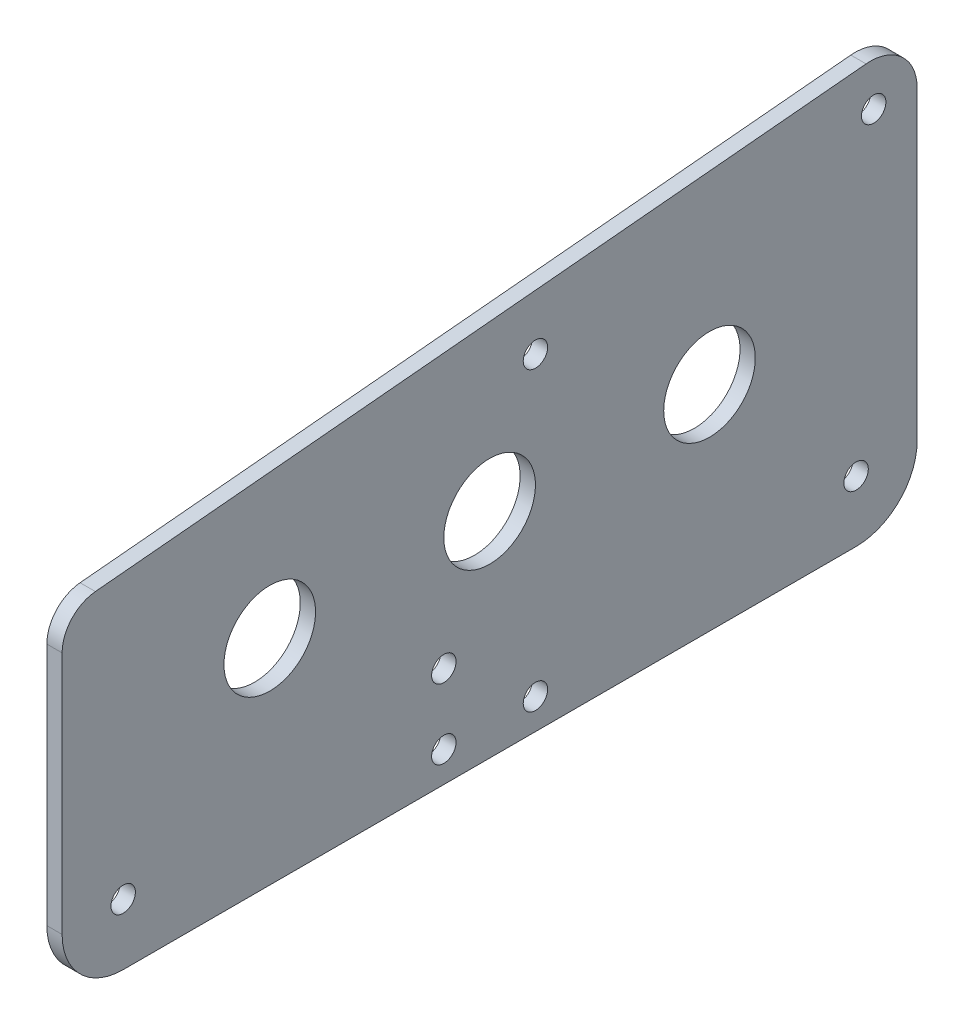
ISO-10303-21;
HEADER;
FILE_DESCRIPTION(('STEP AP214'),'2;1');
FILE_NAME('part.step','',(''),(''),'','','');
FILE_SCHEMA(('AUTOMOTIVE_DESIGN { 1 0 10303 214 1 1 1 1 }'));
ENDSEC;
DATA;
#1=APPLICATION_CONTEXT('core data for automotive mechanical design processes');
#2=APPLICATION_PROTOCOL_DEFINITION('international standard','automotive_design',2000,#1);
#3=PRODUCT_CONTEXT('',#1,'mechanical');
#4=PRODUCT('Part','Part','',(#3));
#5=PRODUCT_RELATED_PRODUCT_CATEGORY('part','',(#4));
#6=PRODUCT_DEFINITION_FORMATION('','',#4);
#7=PRODUCT_DEFINITION_CONTEXT('part definition',#1,'design');
#8=PRODUCT_DEFINITION('design','',#6,#7);
#9=PRODUCT_DEFINITION_SHAPE('','',#8);
#10=(LENGTH_UNIT() NAMED_UNIT(*) SI_UNIT(.MILLI.,.METRE.));
#11=(NAMED_UNIT(*) PLANE_ANGLE_UNIT() SI_UNIT($,.RADIAN.));
#12=(NAMED_UNIT(*) SI_UNIT($,.STERADIAN.) SOLID_ANGLE_UNIT());
#13=UNCERTAINTY_MEASURE_WITH_UNIT(LENGTH_MEASURE(1.E-05),#10,'distance_accuracy_value','');
#14=(GEOMETRIC_REPRESENTATION_CONTEXT(3) GLOBAL_UNCERTAINTY_ASSIGNED_CONTEXT((#13)) GLOBAL_UNIT_ASSIGNED_CONTEXT((#10,
#11,#12)) REPRESENTATION_CONTEXT('',''));
#15=CARTESIAN_POINT('',(0.,0.,0.));
#16=DIRECTION('',(0.,0.,1.));
#17=DIRECTION('',(1.,0.,0.));
#18=AXIS2_PLACEMENT_3D('',#15,#16,#17);
#19=CARTESIAN_POINT('',(4.7625,43.2742885665232,519.572478048036));
#20=DIRECTION('',(1.,0.,0.));
#21=DIRECTION('',(0.,0.,1.));
#22=AXIS2_PLACEMENT_3D('',#19,#20,#21);
#23=CYLINDRICAL_SURFACE('',#22,12.7);
#24=DIRECTION('',(1.,0.,0.));
#25=VECTOR('',#24,1.);
#26=CARTESIAN_POINT('',(4.7625,43.2742885665232,506.872478048036));
#27=LINE('',#26,#25);
#28=CARTESIAN_POINT('',(1.5875,43.2742885665232,506.872478048036));
#29=VERTEX_POINT('',#28);
#30=CARTESIAN_POINT('',(4.7625,43.2742885665232,506.872478048036));
#31=VERTEX_POINT('',#30);
#32=EDGE_CURVE('E11',#29,#31,#27,.T.);
#33=ORIENTED_EDGE('',*,*,#32,.T.);
#34=CARTESIAN_POINT('',(4.7625,43.2742885665232,519.572478048036));
#35=DIRECTION('',(-1.,0.,0.));
#36=DIRECTION('',(0.,0.,1.));
#37=AXIS2_PLACEMENT_3D('',#34,#35,#36);
#38=CIRCLE('',#37,12.7);
#39=CARTESIAN_POINT('',(4.7625,30.5742885665231,519.572478048036));
#40=VERTEX_POINT('',#39);
#41=EDGE_CURVE('E191',#31,#40,#38,.T.);
#42=ORIENTED_EDGE('',*,*,#41,.T.);
#43=DIRECTION('',(1.,0.,0.));
#44=VECTOR('',#43,1.);
#45=CARTESIAN_POINT('',(4.7625,30.5742885665231,519.572478048036));
#46=LINE('',#45,#44);
#47=CARTESIAN_POINT('',(1.5875,30.5742885665231,519.572478048036));
#48=VERTEX_POINT('',#47);
#49=EDGE_CURVE('E49',#48,#40,#46,.T.);
#50=ORIENTED_EDGE('',*,*,#49,.F.);
#51=CARTESIAN_POINT('',(1.5875,43.2742885665232,519.572478048036));
#52=DIRECTION('',(-1.,0.,0.));
#53=DIRECTION('',(0.,0.,1.));
#54=AXIS2_PLACEMENT_3D('',#51,#52,#53);
#55=CIRCLE('',#54,12.7);
#56=EDGE_CURVE('E95',#29,#48,#55,.T.);
#57=ORIENTED_EDGE('',*,*,#56,.F.);
#58=EDGE_LOOP('',(#33,#42,#50,#57));
#59=FACE_BOUND('',#58,.T.);
#60=ADVANCED_FACE('F39',(#59),#23,.T.);
#61=CARTESIAN_POINT('',(4.7625,30.5742885665232,671.972478048036));
#62=DIRECTION('',(0.,-1.,0.));
#63=DIRECTION('',(0.,0.,1.));
#64=AXIS2_PLACEMENT_3D('',#61,#62,#63);
#65=PLANE('',#64);
#66=ORIENTED_EDGE('',*,*,#49,.T.);
#67=DIRECTION('',(0.,0.,1.));
#68=VECTOR('',#67,1.);
#69=CARTESIAN_POINT('',(4.7625,30.5742885665232,671.972478048036));
#70=LINE('',#69,#68);
#71=CARTESIAN_POINT('',(4.7625,30.5742885665231,671.972478048036));
#72=VERTEX_POINT('',#71);
#73=EDGE_CURVE('E186',#40,#72,#70,.T.);
#74=ORIENTED_EDGE('',*,*,#73,.T.);
#75=DIRECTION('',(1.,0.,0.));
#76=VECTOR('',#75,1.);
#77=CARTESIAN_POINT('',(4.7625,30.5742885665231,671.972478048036));
#78=LINE('',#77,#76);
#79=CARTESIAN_POINT('',(1.5875,30.5742885665231,671.972478048036));
#80=VERTEX_POINT('',#79);
#81=EDGE_CURVE('E173',#80,#72,#78,.T.);
#82=ORIENTED_EDGE('',*,*,#81,.F.);
#83=DIRECTION('',(0.,0.,1.));
#84=VECTOR('',#83,1.);
#85=CARTESIAN_POINT('',(1.5875,30.5742885665231,516.597442574255));
#86=LINE('',#85,#84);
#87=EDGE_CURVE('E146',#48,#80,#86,.T.);
#88=ORIENTED_EDGE('',*,*,#87,.F.);
#89=EDGE_LOOP('',(#66,#74,#82,#88));
#90=FACE_BOUND('',#89,.T.);
#91=ADVANCED_FACE('F182',(#90),#65,.T.);
#92=CARTESIAN_POINT('',(4.7625,43.2742885665232,671.972478048036));
#93=DIRECTION('',(1.,0.,0.));
#94=DIRECTION('',(0.,0.,1.));
#95=AXIS2_PLACEMENT_3D('',#92,#93,#94);
#96=CYLINDRICAL_SURFACE('',#95,12.7);
#97=ORIENTED_EDGE('',*,*,#81,.T.);
#98=CARTESIAN_POINT('',(4.7625,43.2742885665232,671.972478048036));
#99=DIRECTION('',(-1.,0.,0.));
#100=DIRECTION('',(0.,0.,1.));
#101=AXIS2_PLACEMENT_3D('',#98,#99,#100);
#102=CIRCLE('',#101,12.7);
#103=CARTESIAN_POINT('',(4.7625,43.2742885665232,684.672478048036));
#104=VERTEX_POINT('',#103);
#105=EDGE_CURVE('E194',#72,#104,#102,.T.);
#106=ORIENTED_EDGE('',*,*,#105,.T.);
#107=DIRECTION('',(1.,0.,0.));
#108=VECTOR('',#107,1.);
#109=CARTESIAN_POINT('',(4.7625,43.2742885665232,684.672478048036));
#110=LINE('',#109,#108);
#111=CARTESIAN_POINT('',(1.5875,43.2742885665232,684.672478048036));
#112=VERTEX_POINT('',#111);
#113=EDGE_CURVE('E170',#112,#104,#110,.T.);
#114=ORIENTED_EDGE('',*,*,#113,.F.);
#115=CARTESIAN_POINT('',(1.5875,43.2742885665232,671.972478048036));
#116=DIRECTION('',(-1.,0.,0.));
#117=DIRECTION('',(0.,0.,1.));
#118=AXIS2_PLACEMENT_3D('',#115,#116,#117);
#119=CIRCLE('',#118,12.7);
#120=EDGE_CURVE('E143',#80,#112,#119,.T.);
#121=ORIENTED_EDGE('',*,*,#120,.F.);
#122=EDGE_LOOP('',(#97,#106,#114,#121));
#123=FACE_BOUND('',#122,.T.);
#124=ADVANCED_FACE('F251',(#123),#96,.T.);
#125=CARTESIAN_POINT('',(4.7625,93.978860816529,684.672478048036));
#126=DIRECTION('',(0.,0.,1.));
#127=DIRECTION('',(0.,1.,0.));
#128=AXIS2_PLACEMENT_3D('',#125,#126,#127);
#129=PLANE('',#128);
#130=ORIENTED_EDGE('',*,*,#113,.T.);
#131=DIRECTION('',(0.,1.,0.));
#132=VECTOR('',#131,1.);
#133=CARTESIAN_POINT('',(4.7625,93.978860816529,684.672478048036));
#134=LINE('',#133,#132);
#135=CARTESIAN_POINT('',(4.7625,93.978860816529,684.672478048036));
#136=VERTEX_POINT('',#135);
#137=EDGE_CURVE('E201',#104,#136,#134,.T.);
#138=ORIENTED_EDGE('',*,*,#137,.T.);
#139=DIRECTION('',(1.,0.,0.));
#140=VECTOR('',#139,1.);
#141=CARTESIAN_POINT('',(4.7625,93.978860816529,684.672478048036));
#142=LINE('',#141,#140);
#143=CARTESIAN_POINT('',(1.5875,93.978860816529,684.672478048036));
#144=VERTEX_POINT('',#143);
#145=EDGE_CURVE('E167',#144,#136,#142,.T.);
#146=ORIENTED_EDGE('',*,*,#145,.F.);
#147=DIRECTION('',(0.,1.,0.));
#148=VECTOR('',#147,1.);
#149=CARTESIAN_POINT('',(1.5875,106.774288566523,684.672478048036));
#150=LINE('',#149,#148);
#151=EDGE_CURVE('E140',#112,#144,#150,.T.);
#152=ORIENTED_EDGE('',*,*,#151,.F.);
#153=EDGE_LOOP('',(#130,#138,#146,#152));
#154=FACE_BOUND('',#153,.T.);
#155=ADVANCED_FACE('F337',(#154),#129,.T.);
#156=CARTESIAN_POINT('',(4.7625,93.978860816529,677.052478048036));
#157=DIRECTION('',(1.,0.,0.));
#158=DIRECTION('',(0.,0.,1.));
#159=AXIS2_PLACEMENT_3D('',#156,#157,#158);
#160=CYLINDRICAL_SURFACE('',#159,7.61999999999997);
#161=ORIENTED_EDGE('',*,*,#145,.T.);
#162=CARTESIAN_POINT('',(4.7625,93.978860816529,677.052478048036));
#163=DIRECTION('',(-1.,0.,0.));
#164=DIRECTION('',(0.,0.,1.));
#165=AXIS2_PLACEMENT_3D('',#162,#163,#164);
#166=CIRCLE('',#165,7.61999999999997);
#167=CARTESIAN_POINT('',(4.7625,101.566176390487,677.757490375002));
#168=VERTEX_POINT('',#167);
#169=EDGE_CURVE('E204',#136,#168,#166,.T.);
#170=ORIENTED_EDGE('',*,*,#169,.T.);
#171=DIRECTION('',(1.,0.,0.));
#172=VECTOR('',#171,1.);
#173=CARTESIAN_POINT('',(4.7625,101.566176390487,677.757490375002));
#174=LINE('',#173,#172);
#175=CARTESIAN_POINT('',(1.5875,101.566176390487,677.757490375002));
#176=VERTEX_POINT('',#175);
#177=EDGE_CURVE('E110',#176,#168,#174,.T.);
#178=ORIENTED_EDGE('',*,*,#177,.F.);
#179=CARTESIAN_POINT('',(1.5875,93.978860816529,677.052478048036));
#180=DIRECTION('',(-1.,0.,0.));
#181=DIRECTION('',(0.,0.,1.));
#182=AXIS2_PLACEMENT_3D('',#179,#180,#181);
#183=CIRCLE('',#182,7.61999999999997);
#184=EDGE_CURVE('E138',#144,#176,#183,.T.);
#185=ORIENTED_EDGE('',*,*,#184,.F.);
#186=EDGE_LOOP('',(#161,#170,#178,#185));
#187=FACE_BOUND('',#186,.T.);
#188=ADVANCED_FACE('F347',(#187),#160,.T.);
#189=CARTESIAN_POINT('',(4.7625,116.457539853395,517.497208961432));
#190=DIRECTION('',(0.,0.995710705243837,0.0925213027514316));
#191=DIRECTION('',(0.,0.0925213027514316,-0.995710705243836));
#192=AXIS2_PLACEMENT_3D('',#189,#190,#191);
#193=PLANE('',#192);
#194=ORIENTED_EDGE('',*,*,#177,.T.);
#195=DIRECTION('',(0.,0.0925213027514316,-0.995710705243836));
#196=VECTOR('',#195,1.);
#197=CARTESIAN_POINT('',(4.7625,116.457539853395,517.497208961432));
#198=LINE('',#197,#196);
#199=CARTESIAN_POINT('',(4.7625,116.457539853395,517.497208961432));
#200=VERTEX_POINT('',#199);
#201=EDGE_CURVE('E207',#168,#200,#198,.T.);
#202=ORIENTED_EDGE('',*,*,#201,.T.);
#203=DIRECTION('',(1.,0.,0.));
#204=VECTOR('',#203,1.);
#205=CARTESIAN_POINT('',(4.7625,116.457539853395,517.497208961432));
#206=LINE('',#205,#204);
#207=CARTESIAN_POINT('',(1.5875,116.457539853395,517.497208961432));
#208=VERTEX_POINT('',#207);
#209=EDGE_CURVE('E108',#208,#200,#206,.T.);
#210=ORIENTED_EDGE('',*,*,#209,.F.);
#211=DIRECTION('',(0.,0.0925213027514316,-0.995710705243836));
#212=VECTOR('',#211,1.);
#213=CARTESIAN_POINT('',(1.5875,116.457539853395,517.497208961432));
#214=LINE('',#213,#212);
#215=EDGE_CURVE('E102',#176,#208,#214,.T.);
#216=ORIENTED_EDGE('',*,*,#215,.F.);
#217=EDGE_LOOP('',(#194,#202,#210,#216));
#218=FACE_BOUND('',#217,.T.);
#219=ADVANCED_FACE('F357',(#218),#193,.T.);
#220=CARTESIAN_POINT('',(4.7625,106.774288566523,516.597442574255));
#221=DIRECTION('',(1.,0.,0.));
#222=DIRECTION('',(0.,0.,1.));
#223=AXIS2_PLACEMENT_3D('',#220,#221,#222);
#224=CYLINDRICAL_SURFACE('',#223,9.72496452621818);
#225=ORIENTED_EDGE('',*,*,#209,.T.);
#226=CARTESIAN_POINT('',(4.7625,106.774288566523,516.597442574255));
#227=DIRECTION('',(-1.,0.,0.));
#228=DIRECTION('',(0.,0.,1.));
#229=AXIS2_PLACEMENT_3D('',#226,#227,#228);
#230=CIRCLE('',#229,9.72496452621818);
#231=CARTESIAN_POINT('',(4.7625,106.774288566523,506.872478048036));
#232=VERTEX_POINT('',#231);
#233=EDGE_CURVE('E57',#200,#232,#230,.T.);
#234=ORIENTED_EDGE('',*,*,#233,.T.);
#235=DIRECTION('',(1.,0.,0.));
#236=VECTOR('',#235,1.);
#237=CARTESIAN_POINT('',(4.7625,106.774288566523,506.872478048036));
#238=LINE('',#237,#236);
#239=CARTESIAN_POINT('',(1.5875,106.774288566523,506.872478048036));
#240=VERTEX_POINT('',#239);
#241=EDGE_CURVE('E43',#240,#232,#238,.T.);
#242=ORIENTED_EDGE('',*,*,#241,.F.);
#243=CARTESIAN_POINT('',(1.5875,106.774288566523,516.597442574255));
#244=DIRECTION('',(-1.,0.,0.));
#245=DIRECTION('',(0.,0.,1.));
#246=AXIS2_PLACEMENT_3D('',#243,#244,#245);
#247=CIRCLE('',#246,9.72496452621818);
#248=EDGE_CURVE('E96',#208,#240,#247,.T.);
#249=ORIENTED_EDGE('',*,*,#248,.F.);
#250=EDGE_LOOP('',(#225,#234,#242,#249));
#251=FACE_BOUND('',#250,.T.);
#252=ADVANCED_FACE('F107',(#251),#224,.T.);
#253=CARTESIAN_POINT('',(4.7625,43.2742885665232,519.572478048036));
#254=DIRECTION('',(1.,0.,0.));
#255=DIRECTION('',(0.,0.,1.));
#256=AXIS2_PLACEMENT_3D('',#253,#254,#255);
#257=CYLINDRICAL_SURFACE('',#256,2.53999999999995);
#258=CARTESIAN_POINT('',(4.7625,43.2742885665232,519.572478048036));
#259=DIRECTION('',(-1.,0.,0.));
#260=DIRECTION('',(0.,0.,1.));
#261=AXIS2_PLACEMENT_3D('',#258,#259,#260);
#262=CIRCLE('',#261,2.53999999999995);
#263=CARTESIAN_POINT('',(4.7625,43.2742885665232,522.112478048036));
#264=VERTEX_POINT('',#263);
#265=EDGE_CURVE('E163',#264,#264,#262,.T.);
#266=ORIENTED_EDGE('',*,*,#265,.F.);
#267=EDGE_LOOP('',(#266));
#268=FACE_BOUND('',#267,.T.);
#269=CARTESIAN_POINT('',(1.5875,43.2742885665232,519.572478048036));
#270=DIRECTION('',(-1.,0.,0.));
#271=DIRECTION('',(0.,0.,1.));
#272=AXIS2_PLACEMENT_3D('',#269,#270,#271);
#273=CIRCLE('',#272,2.53999999999995);
#274=CARTESIAN_POINT('',(1.5875,43.2742885665232,522.112478048036));
#275=VERTEX_POINT('',#274);
#276=EDGE_CURVE('E122',#275,#275,#273,.T.);
#277=ORIENTED_EDGE('',*,*,#276,.T.);
#278=EDGE_LOOP('',(#277));
#279=FACE_BOUND('',#278,.T.);
#280=ADVANCED_FACE('F311',(#268,#279),#257,.F.);
#281=CARTESIAN_POINT('',(4.7625,36.9242885665232,605.297478048036));
#282=DIRECTION('',(1.,0.,0.));
#283=DIRECTION('',(0.,0.,1.));
#284=AXIS2_PLACEMENT_3D('',#281,#282,#283);
#285=CYLINDRICAL_SURFACE('',#284,2.53999999999995);
#286=CARTESIAN_POINT('',(4.7625,36.9242885665232,605.297478048036));
#287=DIRECTION('',(-1.,0.,0.));
#288=DIRECTION('',(0.,0.,1.));
#289=AXIS2_PLACEMENT_3D('',#286,#287,#288);
#290=CIRCLE('',#289,2.53999999999995);
#291=CARTESIAN_POINT('',(4.7625,36.9242885665232,607.837478048036));
#292=VERTEX_POINT('',#291);
#293=EDGE_CURVE('E525',#292,#292,#290,.T.);
#294=ORIENTED_EDGE('',*,*,#293,.F.);
#295=EDGE_LOOP('',(#294));
#296=FACE_BOUND('',#295,.T.);
#297=CARTESIAN_POINT('',(1.5875,36.9242885665232,605.297478048036));
#298=DIRECTION('',(-1.,0.,0.));
#299=DIRECTION('',(0.,0.,1.));
#300=AXIS2_PLACEMENT_3D('',#297,#298,#299);
#301=CIRCLE('',#300,2.53999999999995);
#302=CARTESIAN_POINT('',(1.5875,36.9242885665232,607.837478048036));
#303=VERTEX_POINT('',#302);
#304=EDGE_CURVE('E125',#303,#303,#301,.T.);
#305=ORIENTED_EDGE('',*,*,#304,.T.);
#306=EDGE_LOOP('',(#305));
#307=FACE_BOUND('',#306,.T.);
#308=ADVANCED_FACE('F316',(#296,#307),#285,.F.);
#309=CARTESIAN_POINT('',(4.7625,98.5707187630519,586.247478048036));
#310=DIRECTION('',(1.,0.,0.));
#311=DIRECTION('',(0.,0.,1.));
#312=AXIS2_PLACEMENT_3D('',#309,#310,#311);
#313=CYLINDRICAL_SURFACE('',#312,2.53999999999995);
#314=CARTESIAN_POINT('',(4.7625,98.5707187630519,586.247478048036));
#315=DIRECTION('',(-1.,0.,0.));
#316=DIRECTION('',(0.,0.,1.));
#317=AXIS2_PLACEMENT_3D('',#314,#315,#316);
#318=CIRCLE('',#317,2.53999999999995);
#319=CARTESIAN_POINT('',(4.7625,98.5707187630519,588.787478048036));
#320=VERTEX_POINT('',#319);
#321=EDGE_CURVE('E520',#320,#320,#318,.T.);
#322=ORIENTED_EDGE('',*,*,#321,.F.);
#323=EDGE_LOOP('',(#322));
#324=FACE_BOUND('',#323,.T.);
#325=CARTESIAN_POINT('',(1.5875,98.5707187630519,586.247478048036));
#326=DIRECTION('',(-1.,0.,0.));
#327=DIRECTION('',(0.,0.,1.));
#328=AXIS2_PLACEMENT_3D('',#325,#326,#327);
#329=CIRCLE('',#328,2.53999999999995);
#330=CARTESIAN_POINT('',(1.5875,98.5707187630519,588.787478048036));
#331=VERTEX_POINT('',#330);
#332=EDGE_CURVE('E128',#331,#331,#329,.T.);
#333=ORIENTED_EDGE('',*,*,#332,.T.);
#334=EDGE_LOOP('',(#333));
#335=FACE_BOUND('',#334,.T.);
#336=ADVANCED_FACE('F327',(#324,#335),#313,.F.);
#337=CARTESIAN_POINT('',(4.7625,75.0242885665232,595.772478048036));
#338=DIRECTION('',(1.,0.,0.));
#339=DIRECTION('',(0.,0.,1.));
#340=AXIS2_PLACEMENT_3D('',#337,#338,#339);
#341=CYLINDRICAL_SURFACE('',#340,9.52500000000002);
#342=CARTESIAN_POINT('',(4.7625,75.0242885665232,595.772478048036));
#343=DIRECTION('',(-1.,0.,0.));
#344=DIRECTION('',(0.,0.,1.));
#345=AXIS2_PLACEMENT_3D('',#342,#343,#344);
#346=CIRCLE('',#345,9.52500000000002);
#347=CARTESIAN_POINT('',(4.7625,75.0242885665232,605.297478048036));
#348=VERTEX_POINT('',#347);
#349=EDGE_CURVE('E517',#348,#348,#346,.T.);
#350=ORIENTED_EDGE('',*,*,#349,.F.);
#351=EDGE_LOOP('',(#350));
#352=FACE_BOUND('',#351,.T.);
#353=CARTESIAN_POINT('',(1.5875,75.0242885665232,595.772478048036));
#354=DIRECTION('',(-1.,0.,0.));
#355=DIRECTION('',(0.,0.,1.));
#356=AXIS2_PLACEMENT_3D('',#353,#354,#355);
#357=CIRCLE('',#356,9.52500000000002);
#358=CARTESIAN_POINT('',(1.5875,75.0242885665232,605.297478048036));
#359=VERTEX_POINT('',#358);
#360=EDGE_CURVE('E131',#359,#359,#357,.T.);
#361=ORIENTED_EDGE('',*,*,#360,.T.);
#362=EDGE_LOOP('',(#361));
#363=FACE_BOUND('',#362,.T.);
#364=ADVANCED_FACE('F407',(#352,#363),#341,.F.);
#365=CARTESIAN_POINT('',(4.7625,107.527203864905,515.91124467509));
#366=DIRECTION('',(1.,0.,0.));
#367=DIRECTION('',(0.,0.,1.));
#368=AXIS2_PLACEMENT_3D('',#365,#366,#367);
#369=CYLINDRICAL_SURFACE('',#368,2.53999999999995);
#370=CARTESIAN_POINT('',(4.7625,107.527203864905,515.91124467509));
#371=DIRECTION('',(-1.,0.,0.));
#372=DIRECTION('',(0.,0.,1.));
#373=AXIS2_PLACEMENT_3D('',#370,#371,#372);
#374=CIRCLE('',#373,2.53999999999995);
#375=CARTESIAN_POINT('',(4.7625,107.527203864905,518.45124467509));
#376=VERTEX_POINT('',#375);
#377=EDGE_CURVE('E513',#376,#376,#374,.T.);
#378=ORIENTED_EDGE('',*,*,#377,.F.);
#379=EDGE_LOOP('',(#378));
#380=FACE_BOUND('',#379,.T.);
#381=CARTESIAN_POINT('',(1.5875,107.527203864905,515.91124467509));
#382=DIRECTION('',(-1.,0.,0.));
#383=DIRECTION('',(0.,0.,1.));
#384=AXIS2_PLACEMENT_3D('',#381,#382,#383);
#385=CIRCLE('',#384,2.53999999999995);
#386=CARTESIAN_POINT('',(1.5875,107.527203864905,518.45124467509));
#387=VERTEX_POINT('',#386);
#388=EDGE_CURVE('E105',#387,#387,#385,.T.);
#389=ORIENTED_EDGE('',*,*,#388,.T.);
#390=EDGE_LOOP('',(#389));
#391=FACE_BOUND('',#390,.T.);
#392=ADVANCED_FACE('F258',(#380,#391),#369,.F.);
#393=CARTESIAN_POINT('',(4.7625,43.2742885665232,506.872478048036));
#394=DIRECTION('',(0.,0.,-1.));
#395=DIRECTION('',(0.,-1.,0.));
#396=AXIS2_PLACEMENT_3D('',#393,#394,#395);
#397=PLANE('',#396);
#398=DIRECTION('',(0.,1.,0.));
#399=VECTOR('',#398,1.);
#400=CARTESIAN_POINT('',(1.5875,106.774288566523,506.872478048036));
#401=LINE('',#400,#399);
#402=EDGE_CURVE('E87',#240,#29,#401,.F.);
#403=ORIENTED_EDGE('',*,*,#402,.F.);
#404=ORIENTED_EDGE('',*,*,#241,.T.);
#405=DIRECTION('',(0.,-1.,0.));
#406=VECTOR('',#405,1.);
#407=CARTESIAN_POINT('',(4.7625,43.2742885665232,506.872478048036));
#408=LINE('',#407,#406);
#409=EDGE_CURVE('E192',#232,#31,#408,.T.);
#410=ORIENTED_EDGE('',*,*,#409,.T.);
#411=ORIENTED_EDGE('',*,*,#32,.F.);
#412=EDGE_LOOP('',(#403,#404,#410,#411));
#413=FACE_BOUND('',#412,.T.);
#414=ADVANCED_FACE('F92',(#413),#397,.T.);
#415=CARTESIAN_POINT('',(4.7625,75.0242885665232,550.052478048036));
#416=DIRECTION('',(1.,0.,0.));
#417=DIRECTION('',(0.,0.,1.));
#418=AXIS2_PLACEMENT_3D('',#415,#416,#417);
#419=CYLINDRICAL_SURFACE('',#418,9.52500000000002);
#420=CARTESIAN_POINT('',(4.7625,75.0242885665232,550.052478048036));
#421=DIRECTION('',(-1.,0.,0.));
#422=DIRECTION('',(0.,0.,1.));
#423=AXIS2_PLACEMENT_3D('',#420,#421,#422);
#424=CIRCLE('',#423,9.52500000000002);
#425=CARTESIAN_POINT('',(4.7625,75.0242885665232,559.577478048036));
#426=VERTEX_POINT('',#425);
#427=EDGE_CURVE('E210',#426,#426,#424,.T.);
#428=ORIENTED_EDGE('',*,*,#427,.F.);
#429=EDGE_LOOP('',(#428));
#430=FACE_BOUND('',#429,.T.);
#431=CARTESIAN_POINT('',(1.5875,75.0242885665232,550.052478048036));
#432=DIRECTION('',(-1.,0.,0.));
#433=DIRECTION('',(0.,0.,1.));
#434=AXIS2_PLACEMENT_3D('',#431,#432,#433);
#435=CIRCLE('',#434,9.52500000000002);
#436=CARTESIAN_POINT('',(1.5875,75.0242885665232,559.577478048036));
#437=VERTEX_POINT('',#436);
#438=EDGE_CURVE('E137',#437,#437,#435,.T.);
#439=ORIENTED_EDGE('',*,*,#438,.T.);
#440=EDGE_LOOP('',(#439));
#441=FACE_BOUND('',#440,.T.);
#442=ADVANCED_FACE('F257',(#430,#441),#419,.F.);
#443=CARTESIAN_POINT('',(4.7625,51.4778583699945,605.297478048036));
#444=DIRECTION('',(1.,0.,0.));
#445=DIRECTION('',(0.,0.,1.));
#446=AXIS2_PLACEMENT_3D('',#443,#444,#445);
#447=CYLINDRICAL_SURFACE('',#446,2.54000000000007);
#448=CARTESIAN_POINT('',(4.7625,51.4778583699945,605.297478048036));
#449=DIRECTION('',(-1.,0.,0.));
#450=DIRECTION('',(0.,0.,1.));
#451=AXIS2_PLACEMENT_3D('',#448,#449,#450);
#452=CIRCLE('',#451,2.54000000000007);
#453=CARTESIAN_POINT('',(4.7625,51.4778583699945,607.837478048036));
#454=VERTEX_POINT('',#453);
#455=EDGE_CURVE('E213',#454,#454,#452,.T.);
#456=ORIENTED_EDGE('',*,*,#455,.F.);
#457=EDGE_LOOP('',(#456));
#458=FACE_BOUND('',#457,.T.);
#459=CARTESIAN_POINT('',(1.5875,51.4778583699945,605.297478048036));
#460=DIRECTION('',(-1.,0.,0.));
#461=DIRECTION('',(0.,0.,1.));
#462=AXIS2_PLACEMENT_3D('',#459,#460,#461);
#463=CIRCLE('',#462,2.54000000000007);
#464=CARTESIAN_POINT('',(1.5875,51.4778583699945,607.837478048036));
#465=VERTEX_POINT('',#464);
#466=EDGE_CURVE('E152',#465,#465,#463,.T.);
#467=ORIENTED_EDGE('',*,*,#466,.T.);
#468=EDGE_LOOP('',(#467));
#469=FACE_BOUND('',#468,.T.);
#470=ADVANCED_FACE('F225',(#458,#469),#447,.F.);
#471=CARTESIAN_POINT('',(4.7625,75.0242885665232,641.492478048036));
#472=DIRECTION('',(1.,0.,0.));
#473=DIRECTION('',(0.,0.,1.));
#474=AXIS2_PLACEMENT_3D('',#471,#472,#473);
#475=CYLINDRICAL_SURFACE('',#474,9.52500000000002);
#476=CARTESIAN_POINT('',(4.7625,75.0242885665232,641.492478048036));
#477=DIRECTION('',(-1.,0.,0.));
#478=DIRECTION('',(0.,0.,1.));
#479=AXIS2_PLACEMENT_3D('',#476,#477,#478);
#480=CIRCLE('',#479,9.52500000000002);
#481=CARTESIAN_POINT('',(4.7625,75.0242885665232,651.017478048036));
#482=VERTEX_POINT('',#481);
#483=EDGE_CURVE('E118',#482,#482,#480,.T.);
#484=ORIENTED_EDGE('',*,*,#483,.F.);
#485=EDGE_LOOP('',(#484));
#486=FACE_BOUND('',#485,.T.);
#487=CARTESIAN_POINT('',(1.5875,75.0242885665232,641.492478048036));
#488=DIRECTION('',(-1.,0.,0.));
#489=DIRECTION('',(0.,0.,1.));
#490=AXIS2_PLACEMENT_3D('',#487,#488,#489);
#491=CIRCLE('',#490,9.52500000000002);
#492=CARTESIAN_POINT('',(1.5875,75.0242885665232,651.017478048036));
#493=VERTEX_POINT('',#492);
#494=EDGE_CURVE('E155',#493,#493,#491,.T.);
#495=ORIENTED_EDGE('',*,*,#494,.T.);
#496=EDGE_LOOP('',(#495));
#497=FACE_BOUND('',#496,.T.);
#498=ADVANCED_FACE('F221',(#486,#497),#475,.F.);
#499=CARTESIAN_POINT('',(4.7625,36.9242885665232,586.247478048036));
#500=DIRECTION('',(1.,0.,0.));
#501=DIRECTION('',(0.,0.,1.));
#502=AXIS2_PLACEMENT_3D('',#499,#500,#501);
#503=CYLINDRICAL_SURFACE('',#502,2.53999999999995);
#504=CARTESIAN_POINT('',(4.7625,36.9242885665232,586.247478048036));
#505=DIRECTION('',(-1.,0.,0.));
#506=DIRECTION('',(0.,0.,1.));
#507=AXIS2_PLACEMENT_3D('',#504,#505,#506);
#508=CIRCLE('',#507,2.53999999999995);
#509=CARTESIAN_POINT('',(4.7625,36.9242885665232,588.787478048036));
#510=VERTEX_POINT('',#509);
#511=EDGE_CURVE('E113',#510,#510,#508,.T.);
#512=ORIENTED_EDGE('',*,*,#511,.F.);
#513=EDGE_LOOP('',(#512));
#514=FACE_BOUND('',#513,.T.);
#515=CARTESIAN_POINT('',(1.5875,36.9242885665232,586.247478048036));
#516=DIRECTION('',(-1.,0.,0.));
#517=DIRECTION('',(0.,0.,1.));
#518=AXIS2_PLACEMENT_3D('',#515,#516,#517);
#519=CIRCLE('',#518,2.53999999999995);
#520=CARTESIAN_POINT('',(1.5875,36.9242885665232,588.787478048036));
#521=VERTEX_POINT('',#520);
#522=EDGE_CURVE('E158',#521,#521,#519,.T.);
#523=ORIENTED_EDGE('',*,*,#522,.T.);
#524=EDGE_LOOP('',(#523));
#525=FACE_BOUND('',#524,.T.);
#526=ADVANCED_FACE('F224',(#514,#525),#503,.F.);
#527=CARTESIAN_POINT('',(4.7625,43.2742885665232,671.972478048036));
#528=DIRECTION('',(1.,0.,0.));
#529=DIRECTION('',(0.,0.,1.));
#530=AXIS2_PLACEMENT_3D('',#527,#528,#529);
#531=CYLINDRICAL_SURFACE('',#530,2.53999999999995);
#532=CARTESIAN_POINT('',(4.7625,43.2742885665232,671.972478048036));
#533=DIRECTION('',(-1.,0.,0.));
#534=DIRECTION('',(0.,0.,1.));
#535=AXIS2_PLACEMENT_3D('',#532,#533,#534);
#536=CIRCLE('',#535,2.53999999999995);
#537=CARTESIAN_POINT('',(4.7625,43.2742885665232,674.512478048036));
#538=VERTEX_POINT('',#537);
#539=EDGE_CURVE('E109',#538,#538,#536,.T.);
#540=ORIENTED_EDGE('',*,*,#539,.F.);
#541=EDGE_LOOP('',(#540));
#542=FACE_BOUND('',#541,.T.);
#543=CARTESIAN_POINT('',(1.5875,43.2742885665232,671.972478048036));
#544=DIRECTION('',(-1.,0.,0.));
#545=DIRECTION('',(0.,0.,1.));
#546=AXIS2_PLACEMENT_3D('',#543,#544,#545);
#547=CIRCLE('',#546,2.53999999999995);
#548=CARTESIAN_POINT('',(1.5875,43.2742885665232,674.512478048036));
#549=VERTEX_POINT('',#548);
#550=EDGE_CURVE('E161',#549,#549,#547,.T.);
#551=ORIENTED_EDGE('',*,*,#550,.T.);
#552=EDGE_LOOP('',(#551));
#553=FACE_BOUND('',#552,.T.);
#554=ADVANCED_FACE('F41',(#542,#553),#531,.F.);
#555=CARTESIAN_POINT('',(4.7625,106.774288566523,516.597442574255));
#556=DIRECTION('',(1.,0.,0.));
#557=DIRECTION('',(0.,0.,1.));
#558=AXIS2_PLACEMENT_3D('',#555,#556,#557);
#559=PLANE('',#558);
#560=ORIENTED_EDGE('',*,*,#265,.T.);
#561=EDGE_LOOP('',(#560));
#562=FACE_BOUND('',#561,.T.);
#563=ORIENTED_EDGE('',*,*,#293,.T.);
#564=EDGE_LOOP('',(#563));
#565=FACE_BOUND('',#564,.T.);
#566=ORIENTED_EDGE('',*,*,#321,.T.);
#567=EDGE_LOOP('',(#566));
#568=FACE_BOUND('',#567,.T.);
#569=ORIENTED_EDGE('',*,*,#349,.T.);
#570=EDGE_LOOP('',(#569));
#571=FACE_BOUND('',#570,.T.);
#572=ORIENTED_EDGE('',*,*,#377,.T.);
#573=EDGE_LOOP('',(#572));
#574=FACE_BOUND('',#573,.T.);
#575=ORIENTED_EDGE('',*,*,#233,.F.);
#576=ORIENTED_EDGE('',*,*,#201,.F.);
#577=ORIENTED_EDGE('',*,*,#169,.F.);
#578=ORIENTED_EDGE('',*,*,#137,.F.);
#579=ORIENTED_EDGE('',*,*,#105,.F.);
#580=ORIENTED_EDGE('',*,*,#73,.F.);
#581=ORIENTED_EDGE('',*,*,#41,.F.);
#582=ORIENTED_EDGE('',*,*,#409,.F.);
#583=EDGE_LOOP('',(#575,#576,#577,#578,#579,#580,#581,#582));
#584=FACE_BOUND('',#583,.T.);
#585=ORIENTED_EDGE('',*,*,#427,.T.);
#586=EDGE_LOOP('',(#585));
#587=FACE_BOUND('',#586,.T.);
#588=ORIENTED_EDGE('',*,*,#455,.T.);
#589=EDGE_LOOP('',(#588));
#590=FACE_BOUND('',#589,.T.);
#591=ORIENTED_EDGE('',*,*,#483,.T.);
#592=EDGE_LOOP('',(#591));
#593=FACE_BOUND('',#592,.T.);
#594=ORIENTED_EDGE('',*,*,#511,.T.);
#595=EDGE_LOOP('',(#594));
#596=FACE_BOUND('',#595,.T.);
#597=ORIENTED_EDGE('',*,*,#539,.T.);
#598=EDGE_LOOP('',(#597));
#599=FACE_BOUND('',#598,.T.);
#600=ADVANCED_FACE('F218',(#562,#565,#568,#571,#574,#584,#587,#590,#593,#596,#599),#559,.T.);
#601=CARTESIAN_POINT('',(1.5875,106.774288566523,516.597442574255));
#602=DIRECTION('',(1.,0.,0.));
#603=DIRECTION('',(0.,0.,1.));
#604=AXIS2_PLACEMENT_3D('',#601,#602,#603);
#605=PLANE('',#604);
#606=ORIENTED_EDGE('',*,*,#276,.F.);
#607=EDGE_LOOP('',(#606));
#608=FACE_BOUND('',#607,.T.);
#609=ORIENTED_EDGE('',*,*,#304,.F.);
#610=EDGE_LOOP('',(#609));
#611=FACE_BOUND('',#610,.T.);
#612=ORIENTED_EDGE('',*,*,#332,.F.);
#613=EDGE_LOOP('',(#612));
#614=FACE_BOUND('',#613,.T.);
#615=ORIENTED_EDGE('',*,*,#360,.F.);
#616=EDGE_LOOP('',(#615));
#617=FACE_BOUND('',#616,.T.);
#618=ORIENTED_EDGE('',*,*,#388,.F.);
#619=EDGE_LOOP('',(#618));
#620=FACE_BOUND('',#619,.T.);
#621=ORIENTED_EDGE('',*,*,#248,.T.);
#622=ORIENTED_EDGE('',*,*,#402,.T.);
#623=ORIENTED_EDGE('',*,*,#56,.T.);
#624=ORIENTED_EDGE('',*,*,#87,.T.);
#625=ORIENTED_EDGE('',*,*,#120,.T.);
#626=ORIENTED_EDGE('',*,*,#151,.T.);
#627=ORIENTED_EDGE('',*,*,#184,.T.);
#628=ORIENTED_EDGE('',*,*,#215,.T.);
#629=EDGE_LOOP('',(#621,#622,#623,#624,#625,#626,#627,#628));
#630=FACE_BOUND('',#629,.T.);
#631=ORIENTED_EDGE('',*,*,#438,.F.);
#632=EDGE_LOOP('',(#631));
#633=FACE_BOUND('',#632,.T.);
#634=ORIENTED_EDGE('',*,*,#466,.F.);
#635=EDGE_LOOP('',(#634));
#636=FACE_BOUND('',#635,.T.);
#637=ORIENTED_EDGE('',*,*,#494,.F.);
#638=EDGE_LOOP('',(#637));
#639=FACE_BOUND('',#638,.T.);
#640=ORIENTED_EDGE('',*,*,#522,.F.);
#641=EDGE_LOOP('',(#640));
#642=FACE_BOUND('',#641,.T.);
#643=ORIENTED_EDGE('',*,*,#550,.F.);
#644=EDGE_LOOP('',(#643));
#645=FACE_BOUND('',#644,.T.);
#646=ADVANCED_FACE('F99',(#608,#611,#614,#617,#620,#630,#633,#636,#639,#642,#645),#605,.F.);
#647=CLOSED_SHELL('',(#60,#91,#124,#155,#188,#219,#252,#280,#308,#336,#364,#392,#414,#442,#470,
#498,#526,#554,#600,#646));
#648=MANIFOLD_SOLID_BREP('B2',#647);
#649=ADVANCED_BREP_SHAPE_REPRESENTATION('',(#18,#648),#14);
#650=SHAPE_DEFINITION_REPRESENTATION(#9,#649);
ENDSEC;
END-ISO-10303-21;
